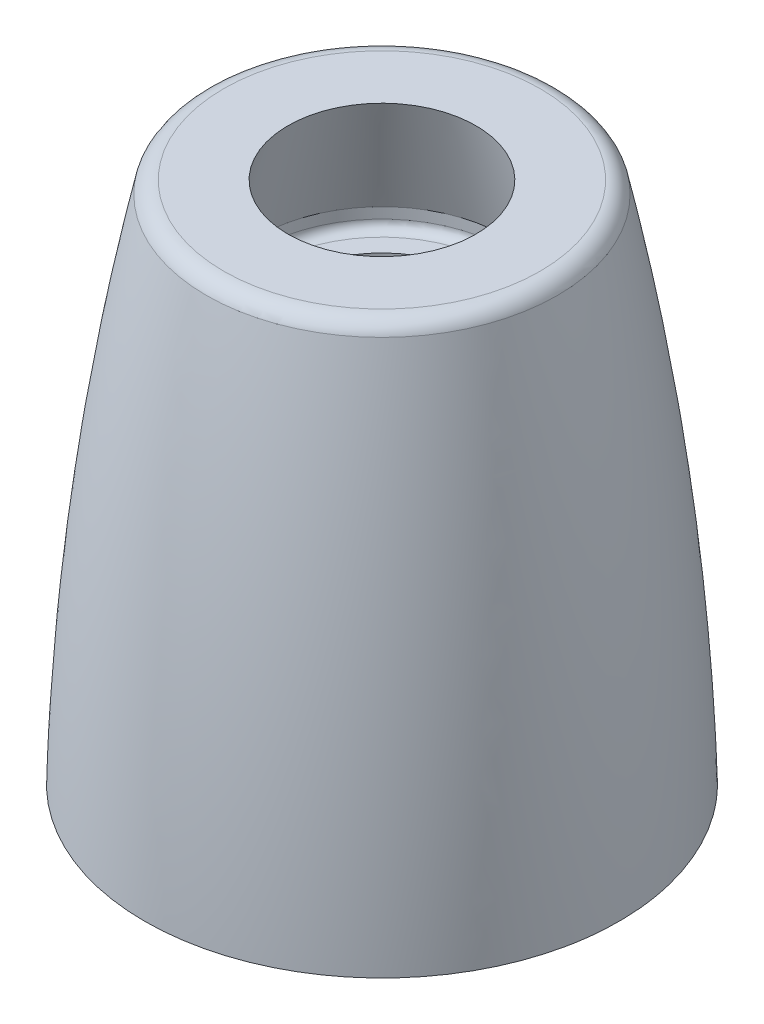
ISO-10303-21;
HEADER;
FILE_DESCRIPTION(('STEP AP214'),'2;1');
FILE_NAME('part.step','',(''),(''),'','','');
FILE_SCHEMA(('AUTOMOTIVE_DESIGN { 1 0 10303 214 1 1 1 1 }'));
ENDSEC;
DATA;
#1=APPLICATION_CONTEXT('core data for automotive mechanical design processes');
#2=APPLICATION_PROTOCOL_DEFINITION('international standard','automotive_design',2000,#1);
#3=PRODUCT_CONTEXT('',#1,'mechanical');
#4=PRODUCT('Part','Part','',(#3));
#5=PRODUCT_RELATED_PRODUCT_CATEGORY('part','',(#4));
#6=PRODUCT_DEFINITION_FORMATION('','',#4);
#7=PRODUCT_DEFINITION_CONTEXT('part definition',#1,'design');
#8=PRODUCT_DEFINITION('design','',#6,#7);
#9=PRODUCT_DEFINITION_SHAPE('','',#8);
#10=(LENGTH_UNIT() NAMED_UNIT(*) SI_UNIT(.MILLI.,.METRE.));
#11=(NAMED_UNIT(*) PLANE_ANGLE_UNIT() SI_UNIT($,.RADIAN.));
#12=(NAMED_UNIT(*) SI_UNIT($,.STERADIAN.) SOLID_ANGLE_UNIT());
#13=UNCERTAINTY_MEASURE_WITH_UNIT(LENGTH_MEASURE(1.E-05),#10,'distance_accuracy_value','');
#14=(GEOMETRIC_REPRESENTATION_CONTEXT(3) GLOBAL_UNCERTAINTY_ASSIGNED_CONTEXT((#13)) GLOBAL_UNIT_ASSIGNED_CONTEXT((#10,
#11,#12)) REPRESENTATION_CONTEXT('',''));
#15=CARTESIAN_POINT('',(0.,0.,0.));
#16=DIRECTION('',(0.,0.,1.));
#17=DIRECTION('',(1.,0.,0.));
#18=AXIS2_PLACEMENT_3D('',#15,#16,#17);
#19=CARTESIAN_POINT('',(6.23062,24.3246111856191,0.));
#20=DIRECTION('',(0.,1.,0.));
#21=DIRECTION('',(1.,0.,0.));
#22=AXIS2_PLACEMENT_3D('',#19,#20,#21);
#23=PLANE('',#22);
#24=CARTESIAN_POINT('',(0.,24.3246111856191,0.));
#25=DIRECTION('',(0.,-1.,0.));
#26=DIRECTION('',(0.,0.,-1.));
#27=AXIS2_PLACEMENT_3D('',#24,#25,#26);
#28=CIRCLE('',#27,5.175);
#29=CARTESIAN_POINT('',(0.,24.3246111856191,5.175));
#30=VERTEX_POINT('',#29);
#31=EDGE_CURVE('E145',#30,#30,#28,.T.);
#32=ORIENTED_EDGE('',*,*,#31,.T.);
#33=EDGE_LOOP('',(#32));
#34=FACE_BOUND('',#33,.T.);
#35=CARTESIAN_POINT('',(0.,24.3246111856191,0.));
#36=DIRECTION('',(0.,-1.,0.));
#37=DIRECTION('',(0.,0.,-1.));
#38=AXIS2_PLACEMENT_3D('',#35,#36,#37);
#39=CIRCLE('',#38,6.23062);
#40=CARTESIAN_POINT('',(0.,24.3246111856191,6.23062));
#41=VERTEX_POINT('',#40);
#42=EDGE_CURVE('E11',#41,#41,#39,.T.);
#43=ORIENTED_EDGE('',*,*,#42,.F.);
#44=EDGE_LOOP('',(#43));
#45=FACE_BOUND('',#44,.T.);
#46=ADVANCED_FACE('F16',(#34,#45),#23,.T.);
#47=CARTESIAN_POINT('',(5.175,15.7722628656191,0.));
#48=DIRECTION('',(0.,-1.,0.));
#49=DIRECTION('',(0.,0.,-1.));
#50=AXIS2_PLACEMENT_3D('',#47,#48,#49);
#51=PLANE('',#50);
#52=CARTESIAN_POINT('',(0.,15.7722628656191,0.));
#53=DIRECTION('',(0.,-1.,0.));
#54=DIRECTION('',(0.,0.,-1.));
#55=AXIS2_PLACEMENT_3D('',#52,#53,#54);
#56=CIRCLE('',#55,5.175);
#57=CARTESIAN_POINT('',(0.,15.7722628656191,5.175));
#58=VERTEX_POINT('',#57);
#59=EDGE_CURVE('E79',#58,#58,#56,.T.);
#60=ORIENTED_EDGE('',*,*,#59,.F.);
#61=EDGE_LOOP('',(#60));
#62=FACE_BOUND('',#61,.T.);
#63=CARTESIAN_POINT('',(0.,15.7722628656191,0.));
#64=DIRECTION('',(0.,-1.,0.));
#65=DIRECTION('',(0.,0.,-1.));
#66=AXIS2_PLACEMENT_3D('',#63,#64,#65);
#67=CIRCLE('',#66,7.779);
#68=CARTESIAN_POINT('',(0.,15.7722628656191,7.779));
#69=VERTEX_POINT('',#68);
#70=EDGE_CURVE('E20',#69,#69,#67,.T.);
#71=ORIENTED_EDGE('',*,*,#70,.T.);
#72=EDGE_LOOP('',(#71));
#73=FACE_BOUND('',#72,.T.);
#74=ADVANCED_FACE('F178',(#62,#73),#51,.T.);
#75=CARTESIAN_POINT('',(9.779,2.85961118561911,0.));
#76=DIRECTION('',(0.,-1.,0.));
#77=DIRECTION('',(0.,0.,-1.));
#78=AXIS2_PLACEMENT_3D('',#75,#76,#77);
#79=PLANE('',#78);
#80=CARTESIAN_POINT('',(0.,2.85961118561913,0.));
#81=DIRECTION('',(0.,-1.,0.));
#82=DIRECTION('',(0.,0.,-1.));
#83=AXIS2_PLACEMENT_3D('',#80,#81,#82);
#84=CIRCLE('',#83,9.779);
#85=CARTESIAN_POINT('',(0.,2.85961118561913,9.779));
#86=VERTEX_POINT('',#85);
#87=EDGE_CURVE('E109',#86,#86,#84,.T.);
#88=ORIENTED_EDGE('',*,*,#87,.F.);
#89=EDGE_LOOP('',(#88));
#90=FACE_BOUND('',#89,.T.);
#91=CARTESIAN_POINT('',(0.,2.8596111856191,0.));
#92=DIRECTION('',(0.,-1.,0.));
#93=DIRECTION('',(0.,0.,-1.));
#94=AXIS2_PLACEMENT_3D('',#91,#92,#93);
#95=CIRCLE('',#94,12.9487371025054);
#96=CARTESIAN_POINT('',(0.,2.8596111856191,12.9487371025054));
#97=VERTEX_POINT('',#96);
#98=EDGE_CURVE('E111',#97,#97,#95,.T.);
#99=ORIENTED_EDGE('',*,*,#98,.T.);
#100=EDGE_LOOP('',(#99));
#101=FACE_BOUND('',#100,.T.);
#102=ADVANCED_FACE('F18',(#90,#101),#79,.T.);
#103=CARTESIAN_POINT('',(8.63475526060741,31.4346111856191,0.));
#104=DIRECTION('',(0.,1.,0.));
#105=DIRECTION('',(1.,0.,0.));
#106=AXIS2_PLACEMENT_3D('',#103,#104,#105);
#107=PLANE('',#106);
#108=CARTESIAN_POINT('',(0.,31.4346111856191,0.));
#109=DIRECTION('',(0.,-1.,0.));
#110=DIRECTION('',(0.,0.,-1.));
#111=AXIS2_PLACEMENT_3D('',#108,#109,#110);
#112=CIRCLE('',#111,5.1308);
#113=CARTESIAN_POINT('',(0.,31.4346111856191,5.1308));
#114=VERTEX_POINT('',#113);
#115=EDGE_CURVE('E95',#114,#114,#112,.T.);
#116=ORIENTED_EDGE('',*,*,#115,.T.);
#117=EDGE_LOOP('',(#116));
#118=FACE_BOUND('',#117,.T.);
#119=CARTESIAN_POINT('',(0.,31.4346111856191,0.));
#120=DIRECTION('',(0.,-1.,0.));
#121=DIRECTION('',(0.,0.,-1.));
#122=AXIS2_PLACEMENT_3D('',#119,#120,#121);
#123=CIRCLE('',#122,8.63475526060741);
#124=CARTESIAN_POINT('',(0.,31.4346111856191,8.63475526060741));
#125=VERTEX_POINT('',#124);
#126=EDGE_CURVE('E91',#125,#125,#123,.T.);
#127=ORIENTED_EDGE('',*,*,#126,.F.);
#128=EDGE_LOOP('',(#127));
#129=FACE_BOUND('',#128,.T.);
#130=ADVANCED_FACE('F206',(#118,#129),#107,.T.);
#131=CARTESIAN_POINT('',(0.,24.8249911856191,0.));
#132=DIRECTION('',(0.,-1.,0.));
#133=DIRECTION('',(0.,0.,-1.));
#134=AXIS2_PLACEMENT_3D('',#131,#132,#133);
#135=TOROIDAL_SURFACE('',#134,6.23062,0.50038);
#136=CARTESIAN_POINT('',(0.,24.8249911856191,0.));
#137=DIRECTION('',(0.,-1.,0.));
#138=DIRECTION('',(0.,0.,-1.));
#139=AXIS2_PLACEMENT_3D('',#136,#137,#138);
#140=CIRCLE('',#139,6.731);
#141=CARTESIAN_POINT('',(0.,24.8249911856191,6.731));
#142=VERTEX_POINT('',#141);
#143=EDGE_CURVE('E116',#142,#142,#140,.T.);
#144=ORIENTED_EDGE('',*,*,#143,.F.);
#145=CARTESIAN_POINT('',(0.,24.8249911856191,6.23062));
#146=DIRECTION('',(1.,0.,0.));
#147=DIRECTION('',(0.,0.,1.));
#148=AXIS2_PLACEMENT_3D('',#145,#146,#147);
#149=CIRCLE('',#148,0.50038);
#150=EDGE_CURVE('E27',#142,#41,#149,.T.);
#151=ORIENTED_EDGE('',*,*,#150,.T.);
#152=ORIENTED_EDGE('',*,*,#42,.T.);
#153=ORIENTED_EDGE('',*,*,#150,.F.);
#154=EDGE_LOOP('',(#144,#151,#152,#153));
#155=FACE_BOUND('',#154,.T.);
#156=ADVANCED_FACE('F202',(#155),#135,.F.);
#157=CARTESIAN_POINT('',(0.,31.0037578537676,0.));
#158=DIRECTION('',(0.,-1.,0.));
#159=DIRECTION('',(0.,0.,-1.));
#160=AXIS2_PLACEMENT_3D('',#157,#158,#159);
#161=CYLINDRICAL_SURFACE('',#160,6.731);
#162=CARTESIAN_POINT('',(0.,25.4097866328367,0.));
#163=DIRECTION('',(0.,-1.,0.));
#164=DIRECTION('',(0.,0.,-1.));
#165=AXIS2_PLACEMENT_3D('',#162,#163,#164);
#166=CIRCLE('',#165,6.731);
#167=CARTESIAN_POINT('',(0.,25.4097866328367,6.731));
#168=VERTEX_POINT('',#167);
#169=EDGE_CURVE('E130',#168,#168,#166,.T.);
#170=ORIENTED_EDGE('',*,*,#169,.F.);
#171=DIRECTION('',(0.,-1.,0.));
#172=VECTOR('',#171,1.);
#173=CARTESIAN_POINT('',(0.,31.0037578537676,6.731));
#174=LINE('',#173,#172);
#175=EDGE_CURVE('E122',#168,#142,#174,.T.);
#176=ORIENTED_EDGE('',*,*,#175,.T.);
#177=ORIENTED_EDGE('',*,*,#143,.T.);
#178=ORIENTED_EDGE('',*,*,#175,.F.);
#179=EDGE_LOOP('',(#170,#176,#177,#178));
#180=FACE_BOUND('',#179,.T.);
#181=ADVANCED_FACE('F205',(#180),#161,.F.);
#182=CARTESIAN_POINT('',(0.,31.4346111856191,0.));
#183=DIRECTION('',(0.,-1.,0.));
#184=DIRECTION('',(0.,0.,-1.));
#185=AXIS2_PLACEMENT_3D('',#182,#183,#184);
#186=CONICAL_SURFACE('',#185,5.1308,0.259607300018462);
#187=ORIENTED_EDGE('',*,*,#115,.F.);
#188=DIRECTION('',(0.,-0.966490859144819,0.256701030752721));
#189=VECTOR('',#188,1.);
#190=CARTESIAN_POINT('',(0.,31.4346111856191,5.1308));
#191=LINE('',#190,#189);
#192=EDGE_CURVE('E103',#114,#168,#191,.T.);
#193=ORIENTED_EDGE('',*,*,#192,.T.);
#194=ORIENTED_EDGE('',*,*,#169,.T.);
#195=ORIENTED_EDGE('',*,*,#192,.F.);
#196=EDGE_LOOP('',(#187,#193,#194,#195));
#197=FACE_BOUND('',#196,.T.);
#198=ADVANCED_FACE('F209',(#197),#186,.F.);
#199=CARTESIAN_POINT('',(0.,30.4346111856202,0.));
#200=DIRECTION('',(0.,-1.,0.));
#201=DIRECTION('',(0.,0.,-1.));
#202=AXIS2_PLACEMENT_3D('',#199,#200,#201);
#203=TOROIDAL_SURFACE('',#202,8.63475526060741,0.999999999998937);
#204=CARTESIAN_POINT('',(0.,30.7624474661681,0.));
#205=DIRECTION('',(0.,-1.,0.));
#206=DIRECTION('',(0.,0.,-1.));
#207=AXIS2_PLACEMENT_3D('',#204,#205,#206);
#208=CIRCLE('',#207,9.57948981229606);
#209=CARTESIAN_POINT('',(0.,30.7624474661681,9.57948981229606));
#210=VERTEX_POINT('',#209);
#211=EDGE_CURVE('E105',#210,#210,#208,.T.);
#212=ORIENTED_EDGE('',*,*,#211,.F.);
#213=CARTESIAN_POINT('',(0.,30.4346111856202,8.63475526060741));
#214=DIRECTION('',(-1.,0.,0.));
#215=DIRECTION('',(0.,0.,1.));
#216=AXIS2_PLACEMENT_3D('',#213,#214,#215);
#217=CIRCLE('',#216,0.999999999998937);
#218=EDGE_CURVE('E87',#210,#125,#217,.T.);
#219=ORIENTED_EDGE('',*,*,#218,.T.);
#220=ORIENTED_EDGE('',*,*,#126,.T.);
#221=ORIENTED_EDGE('',*,*,#218,.F.);
#222=EDGE_LOOP('',(#212,#219,#220,#221));
#223=FACE_BOUND('',#222,.T.);
#224=ADVANCED_FACE('F92',(#223),#203,.T.);
#225=CARTESIAN_POINT('',(0.,30.7624474661681,9.57948981229604));
#226=CARTESIAN_POINT('',(-9.57948981229604,30.7624474661681,9.57948981229604));
#227=CARTESIAN_POINT('',(-9.57948981229604,30.7624474661681,0.));
#228=CARTESIAN_POINT('',(-9.57948981229604,30.7624474661681,-9.57948981229604));
#229=CARTESIAN_POINT('',(0.,30.7624474661681,-9.57948981229604));
#230=CARTESIAN_POINT('',(9.57948981229604,30.7624474661681,-9.57948981229604));
#231=CARTESIAN_POINT('',(9.57948981229604,30.7624474661681,0.));
#232=CARTESIAN_POINT('',(9.57948981229604,30.7624474661681,9.57948981229604));
#233=CARTESIAN_POINT('',(0.,30.7624474661681,9.57948981229604));
#234=CARTESIAN_POINT('',(0.,16.9685337281054,12.5685055574263));
#235=CARTESIAN_POINT('',(-12.5685055574263,16.9685337281054,12.5685055574263));
#236=CARTESIAN_POINT('',(-12.5685055574263,16.9685337281054,0.));
#237=CARTESIAN_POINT('',(-12.5685055574263,16.9685337281054,-12.5685055574263));
#238=CARTESIAN_POINT('',(0.,16.9685337281054,-12.5685055574263));
#239=CARTESIAN_POINT('',(12.5685055574263,16.9685337281054,-12.5685055574263));
#240=CARTESIAN_POINT('',(12.5685055574263,16.9685337281054,0.));
#241=CARTESIAN_POINT('',(12.5685055574263,16.9685337281054,12.5685055574263));
#242=CARTESIAN_POINT('',(0.,16.9685337281054,12.5685055574263));
#243=CARTESIAN_POINT('',(0.,2.8596111856191,12.9487371025054));
#244=CARTESIAN_POINT('',(-12.9487371025054,2.8596111856191,12.9487371025054));
#245=CARTESIAN_POINT('',(-12.9487371025054,2.8596111856191,0.));
#246=CARTESIAN_POINT('',(-12.9487371025054,2.8596111856191,-12.9487371025054));
#247=CARTESIAN_POINT('',(0.,2.8596111856191,-12.9487371025054));
#248=CARTESIAN_POINT('',(12.9487371025054,2.8596111856191,-12.9487371025054));
#249=CARTESIAN_POINT('',(12.9487371025054,2.8596111856191,0.));
#250=CARTESIAN_POINT('',(12.9487371025054,2.8596111856191,12.9487371025054));
#251=CARTESIAN_POINT('',(0.,2.8596111856191,12.9487371025054));
#252=(BOUNDED_SURFACE() B_SPLINE_SURFACE(2,2,((#225,#226,#227,#228,#229,#230,#231,#232,#233),
(#234,#235,#236,#237,#238,#239,#240,#241,#242),(#243,#244,#245,#246,#247,#248,#249,#250,#251)),
.UNSPECIFIED.,.F.,.T.,.F.) B_SPLINE_SURFACE_WITH_KNOTS((3,3),(3,2,2,2,3),(-0.213391800025536,
-0.0269432007689089),(-3.14159265358979,-1.5707963267949,0.,1.5707963267949,3.14159265358979),
.UNSPECIFIED.) GEOMETRIC_REPRESENTATION_ITEM() RATIONAL_B_SPLINE_SURFACE(((1.,0.707106781186548,
1.,0.707106781186548,1.,0.707106781186548,1.,0.707106781186548,1.),(0.99565776112968,
0.704036354635812,0.99565776112968,0.704036354635812,0.99565776112968,0.704036354635812,
0.99565776112968,0.704036354635812,0.99565776112968),(1.,0.707106781186548,1.,0.707106781186548,
1.,0.707106781186548,1.,0.707106781186548,1.))) REPRESENTATION_ITEM('') SURFACE());
#253=CARTESIAN_POINT('',(0.,-1.20724054969762,-137.956407060144));
#254=DIRECTION('',(-1.,0.,0.));
#255=DIRECTION('',(0.,0.,1.));
#256=AXIS2_PLACEMENT_3D('',#253,#254,#255);
#257=CIRCLE('',#256,150.959934478613);
#258=EDGE_CURVE('E114',#97,#210,#257,.T.);
#259=ORIENTED_EDGE('',*,*,#98,.F.);
#260=ORIENTED_EDGE('',*,*,#258,.T.);
#261=ORIENTED_EDGE('',*,*,#211,.T.);
#262=ORIENTED_EDGE('',*,*,#258,.F.);
#263=EDGE_LOOP('',(#259,#260,#261,#262));
#264=FACE_BOUND('',#263,.T.);
#265=ADVANCED_FACE('F189',(#264),#252,.F.);
#266=CARTESIAN_POINT('',(0.,31.0037578537676,0.));
#267=DIRECTION('',(0.,-1.,0.));
#268=DIRECTION('',(0.,0.,-1.));
#269=AXIS2_PLACEMENT_3D('',#266,#267,#268);
#270=CYLINDRICAL_SURFACE('',#269,9.779);
#271=CARTESIAN_POINT('',(0.,13.7722628656191,0.));
#272=DIRECTION('',(0.,-1.,0.));
#273=DIRECTION('',(0.,0.,-1.));
#274=AXIS2_PLACEMENT_3D('',#271,#272,#273);
#275=CIRCLE('',#274,9.779);
#276=CARTESIAN_POINT('',(0.,13.7722628656191,9.779));
#277=VERTEX_POINT('',#276);
#278=EDGE_CURVE('E151',#277,#277,#275,.T.);
#279=ORIENTED_EDGE('',*,*,#278,.F.);
#280=DIRECTION('',(0.,-1.,0.));
#281=VECTOR('',#280,1.);
#282=CARTESIAN_POINT('',(0.,31.0037578537676,9.779));
#283=LINE('',#282,#281);
#284=EDGE_CURVE('E147',#277,#86,#283,.T.);
#285=ORIENTED_EDGE('',*,*,#284,.T.);
#286=ORIENTED_EDGE('',*,*,#87,.T.);
#287=ORIENTED_EDGE('',*,*,#284,.F.);
#288=EDGE_LOOP('',(#279,#285,#286,#287));
#289=FACE_BOUND('',#288,.T.);
#290=ADVANCED_FACE('F182',(#289),#270,.F.);
#291=CARTESIAN_POINT('',(0.,13.7722628656191,0.));
#292=DIRECTION('',(0.,-1.,0.));
#293=DIRECTION('',(0.,0.,-1.));
#294=AXIS2_PLACEMENT_3D('',#291,#292,#293);
#295=TOROIDAL_SURFACE('',#294,7.779,2.);
#296=ORIENTED_EDGE('',*,*,#70,.F.);
#297=CARTESIAN_POINT('',(0.,13.7722628656191,7.779));
#298=DIRECTION('',(1.,0.,0.));
#299=DIRECTION('',(0.,0.,1.));
#300=AXIS2_PLACEMENT_3D('',#297,#298,#299);
#301=CIRCLE('',#300,2.);
#302=EDGE_CURVE('E163',#69,#277,#301,.T.);
#303=ORIENTED_EDGE('',*,*,#302,.T.);
#304=ORIENTED_EDGE('',*,*,#278,.T.);
#305=ORIENTED_EDGE('',*,*,#302,.F.);
#306=EDGE_LOOP('',(#296,#303,#304,#305));
#307=FACE_BOUND('',#306,.T.);
#308=ADVANCED_FACE('F179',(#307),#295,.F.);
#309=CARTESIAN_POINT('',(0.,31.0037578537676,0.));
#310=DIRECTION('',(0.,-1.,0.));
#311=DIRECTION('',(0.,0.,-1.));
#312=AXIS2_PLACEMENT_3D('',#309,#310,#311);
#313=CYLINDRICAL_SURFACE('',#312,5.175);
#314=ORIENTED_EDGE('',*,*,#31,.F.);
#315=DIRECTION('',(0.,-1.,0.));
#316=VECTOR('',#315,1.);
#317=CARTESIAN_POINT('',(0.,31.0037578537676,5.175));
#318=LINE('',#317,#316);
#319=EDGE_CURVE('E71',#30,#58,#318,.T.);
#320=ORIENTED_EDGE('',*,*,#319,.T.);
#321=ORIENTED_EDGE('',*,*,#59,.T.);
#322=ORIENTED_EDGE('',*,*,#319,.F.);
#323=EDGE_LOOP('',(#314,#320,#321,#322));
#324=FACE_BOUND('',#323,.T.);
#325=ADVANCED_FACE('F181',(#324),#313,.F.);
#326=CLOSED_SHELL('',(#46,#74,#102,#130,#156,#181,#198,#224,#265,#290,#308,#325));
#327=MANIFOLD_SOLID_BREP('B1',#326);
#328=ADVANCED_BREP_SHAPE_REPRESENTATION('',(#18,#327),#14);
#329=SHAPE_DEFINITION_REPRESENTATION(#9,#328);
ENDSEC;
END-ISO-10303-21;
